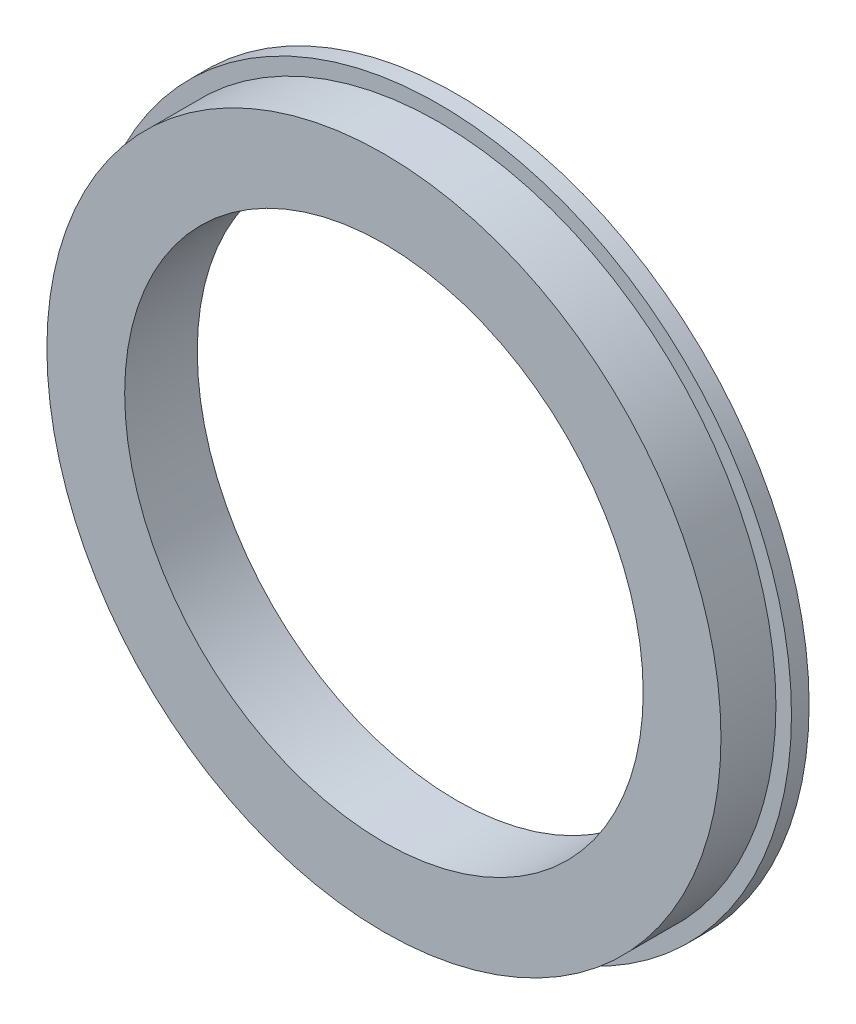
ISO-10303-21;
HEADER;
FILE_DESCRIPTION(('STEP AP214'),'2;1');
FILE_NAME('part.step','',(''),(''),'','','');
FILE_SCHEMA(('AUTOMOTIVE_DESIGN { 1 0 10303 214 1 1 1 1 }'));
ENDSEC;
DATA;
#1=APPLICATION_CONTEXT('core data for automotive mechanical design processes');
#2=APPLICATION_PROTOCOL_DEFINITION('international standard','automotive_design',2000,#1);
#3=PRODUCT_CONTEXT('',#1,'mechanical');
#4=PRODUCT('Part','Part','',(#3));
#5=PRODUCT_RELATED_PRODUCT_CATEGORY('part','',(#4));
#6=PRODUCT_DEFINITION_FORMATION('','',#4);
#7=PRODUCT_DEFINITION_CONTEXT('part definition',#1,'design');
#8=PRODUCT_DEFINITION('design','',#6,#7);
#9=PRODUCT_DEFINITION_SHAPE('','',#8);
#10=(LENGTH_UNIT() NAMED_UNIT(*) SI_UNIT(.MILLI.,.METRE.));
#11=(NAMED_UNIT(*) PLANE_ANGLE_UNIT() SI_UNIT($,.RADIAN.));
#12=(NAMED_UNIT(*) SI_UNIT($,.STERADIAN.) SOLID_ANGLE_UNIT());
#13=UNCERTAINTY_MEASURE_WITH_UNIT(LENGTH_MEASURE(1.E-05),#10,'distance_accuracy_value','');
#14=(GEOMETRIC_REPRESENTATION_CONTEXT(3) GLOBAL_UNCERTAINTY_ASSIGNED_CONTEXT((#13)) GLOBAL_UNIT_ASSIGNED_CONTEXT((#10,
#11,#12)) REPRESENTATION_CONTEXT('',''));
#15=CARTESIAN_POINT('',(0.,0.,0.));
#16=DIRECTION('',(0.,0.,1.));
#17=DIRECTION('',(1.,0.,0.));
#18=AXIS2_PLACEMENT_3D('',#15,#16,#17);
#19=CARTESIAN_POINT('',(0.,0.,7.));
#20=DIRECTION('',(0.,0.,1.));
#21=DIRECTION('',(1.,0.,0.));
#22=AXIS2_PLACEMENT_3D('',#19,#20,#21);
#23=PLANE('',#22);
#24=CARTESIAN_POINT('',(0.,0.,7.));
#25=DIRECTION('',(0.,0.,1.));
#26=DIRECTION('',(1.,0.,0.));
#27=AXIS2_PLACEMENT_3D('',#24,#25,#26);
#28=CIRCLE('',#27,32.5);
#29=CARTESIAN_POINT('',(32.5,0.,7.));
#30=VERTEX_POINT('',#29);
#31=EDGE_CURVE('E10',#30,#30,#28,.T.);
#32=ORIENTED_EDGE('',*,*,#31,.T.);
#33=EDGE_LOOP('',(#32));
#34=FACE_BOUND('',#33,.T.);
#35=CARTESIAN_POINT('',(0.,0.,7.));
#36=DIRECTION('',(0.,0.,1.));
#37=DIRECTION('',(1.,0.,0.));
#38=AXIS2_PLACEMENT_3D('',#35,#36,#37);
#39=CIRCLE('',#38,25.);
#40=CARTESIAN_POINT('',(25.,0.,7.));
#41=VERTEX_POINT('',#40);
#42=EDGE_CURVE('E51',#41,#41,#39,.T.);
#43=ORIENTED_EDGE('',*,*,#42,.F.);
#44=EDGE_LOOP('',(#43));
#45=FACE_BOUND('',#44,.T.);
#46=ADVANCED_FACE('F43',(#34,#45),#23,.T.);
#47=CARTESIAN_POINT('',(0.,0.,0.));
#48=DIRECTION('',(0.,0.,1.));
#49=DIRECTION('',(1.,0.,0.));
#50=AXIS2_PLACEMENT_3D('',#47,#48,#49);
#51=PLANE('',#50);
#52=CARTESIAN_POINT('',(0.,0.,0.));
#53=DIRECTION('',(0.,0.,1.));
#54=DIRECTION('',(1.,0.,0.));
#55=AXIS2_PLACEMENT_3D('',#52,#53,#54);
#56=CIRCLE('',#55,25.);
#57=CARTESIAN_POINT('',(25.,0.,0.));
#58=VERTEX_POINT('',#57);
#59=EDGE_CURVE('E56',#58,#58,#56,.T.);
#60=ORIENTED_EDGE('',*,*,#59,.T.);
#61=EDGE_LOOP('',(#60));
#62=FACE_BOUND('',#61,.T.);
#63=CARTESIAN_POINT('',(0.,0.,0.));
#64=DIRECTION('',(0.,0.,1.));
#65=DIRECTION('',(1.,0.,0.));
#66=AXIS2_PLACEMENT_3D('',#63,#64,#65);
#67=CIRCLE('',#66,34.);
#68=CARTESIAN_POINT('',(34.,0.,0.));
#69=VERTEX_POINT('',#68);
#70=EDGE_CURVE('E64',#69,#69,#67,.T.);
#71=ORIENTED_EDGE('',*,*,#70,.F.);
#72=EDGE_LOOP('',(#71));
#73=FACE_BOUND('',#72,.T.);
#74=ADVANCED_FACE('F93',(#62,#73),#51,.F.);
#75=CARTESIAN_POINT('',(0.,0.,7.));
#76=DIRECTION('',(0.,0.,-1.));
#77=DIRECTION('',(-1.,0.,0.));
#78=AXIS2_PLACEMENT_3D('',#75,#76,#77);
#79=CYLINDRICAL_SURFACE('',#78,32.5);
#80=CARTESIAN_POINT('',(0.,0.,1.7));
#81=DIRECTION('',(0.,0.,1.));
#82=DIRECTION('',(1.,0.,0.));
#83=AXIS2_PLACEMENT_3D('',#80,#81,#82);
#84=CIRCLE('',#83,32.5);
#85=CARTESIAN_POINT('',(32.5,0.,1.7));
#86=VERTEX_POINT('',#85);
#87=EDGE_CURVE('E68',#86,#86,#84,.T.);
#88=ORIENTED_EDGE('',*,*,#87,.T.);
#89=EDGE_LOOP('',(#88));
#90=FACE_BOUND('',#89,.T.);
#91=ORIENTED_EDGE('',*,*,#31,.F.);
#92=EDGE_LOOP('',(#91));
#93=FACE_BOUND('',#92,.T.);
#94=ADVANCED_FACE('F45',(#90,#93),#79,.T.);
#95=CARTESIAN_POINT('',(0.,0.,7.));
#96=DIRECTION('',(0.,0.,-1.));
#97=DIRECTION('',(-1.,0.,0.));
#98=AXIS2_PLACEMENT_3D('',#95,#96,#97);
#99=CYLINDRICAL_SURFACE('',#98,25.);
#100=ORIENTED_EDGE('',*,*,#42,.T.);
#101=EDGE_LOOP('',(#100));
#102=FACE_BOUND('',#101,.T.);
#103=ORIENTED_EDGE('',*,*,#59,.F.);
#104=EDGE_LOOP('',(#103));
#105=FACE_BOUND('',#104,.T.);
#106=ADVANCED_FACE('F81',(#102,#105),#99,.F.);
#107=CARTESIAN_POINT('',(0.,0.,1.7));
#108=DIRECTION('',(0.,0.,1.));
#109=DIRECTION('',(1.,0.,0.));
#110=AXIS2_PLACEMENT_3D('',#107,#108,#109);
#111=PLANE('',#110);
#112=CARTESIAN_POINT('',(0.,0.,1.7));
#113=DIRECTION('',(0.,0.,1.));
#114=DIRECTION('',(1.,0.,0.));
#115=AXIS2_PLACEMENT_3D('',#112,#113,#114);
#116=CIRCLE('',#115,34.);
#117=CARTESIAN_POINT('',(34.,0.,1.7));
#118=VERTEX_POINT('',#117);
#119=EDGE_CURVE('E62',#118,#118,#116,.T.);
#120=ORIENTED_EDGE('',*,*,#119,.T.);
#121=EDGE_LOOP('',(#120));
#122=FACE_BOUND('',#121,.T.);
#123=ORIENTED_EDGE('',*,*,#87,.F.);
#124=EDGE_LOOP('',(#123));
#125=FACE_BOUND('',#124,.T.);
#126=ADVANCED_FACE('F78',(#122,#125),#111,.T.);
#127=CARTESIAN_POINT('',(0.,0.,1.7));
#128=DIRECTION('',(0.,0.,-1.));
#129=DIRECTION('',(-1.,0.,0.));
#130=AXIS2_PLACEMENT_3D('',#127,#128,#129);
#131=CYLINDRICAL_SURFACE('',#130,34.);
#132=ORIENTED_EDGE('',*,*,#119,.F.);
#133=EDGE_LOOP('',(#132));
#134=FACE_BOUND('',#133,.T.);
#135=ORIENTED_EDGE('',*,*,#70,.T.);
#136=EDGE_LOOP('',(#135));
#137=FACE_BOUND('',#136,.T.);
#138=ADVANCED_FACE('F80',(#134,#137),#131,.T.);
#139=CLOSED_SHELL('',(#46,#74,#94,#106,#126,#138));
#140=MANIFOLD_SOLID_BREP('B2',#139);
#141=ADVANCED_BREP_SHAPE_REPRESENTATION('',(#18,#140),#14);
#142=SHAPE_DEFINITION_REPRESENTATION(#9,#141);
ENDSEC;
END-ISO-10303-21;
